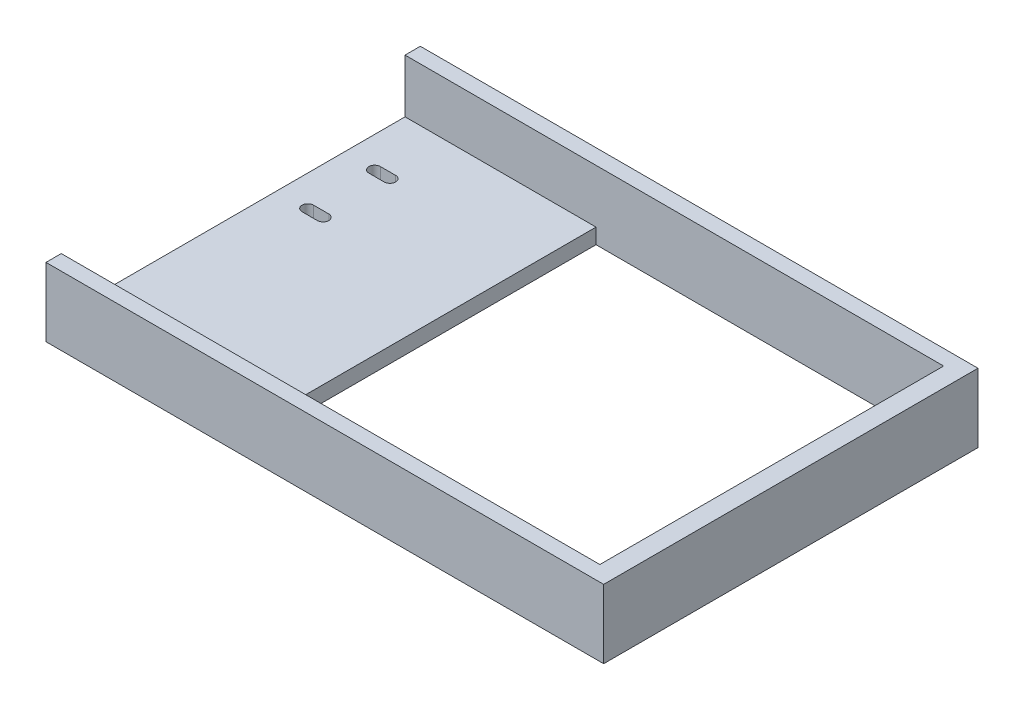
ISO-10303-21;
HEADER;
FILE_DESCRIPTION(('STEP AP214'),'2;1');
FILE_NAME('part.step','',(''),(''),'','','');
FILE_SCHEMA(('AUTOMOTIVE_DESIGN { 1 0 10303 214 1 1 1 1 }'));
ENDSEC;
DATA;
#1=APPLICATION_CONTEXT('core data for automotive mechanical design processes');
#2=APPLICATION_PROTOCOL_DEFINITION('international standard','automotive_design',2000,#1);
#3=PRODUCT_CONTEXT('',#1,'mechanical');
#4=PRODUCT('Part','Part','',(#3));
#5=PRODUCT_RELATED_PRODUCT_CATEGORY('part','',(#4));
#6=PRODUCT_DEFINITION_FORMATION('','',#4);
#7=PRODUCT_DEFINITION_CONTEXT('part definition',#1,'design');
#8=PRODUCT_DEFINITION('design','',#6,#7);
#9=PRODUCT_DEFINITION_SHAPE('','',#8);
#10=(LENGTH_UNIT() NAMED_UNIT(*) SI_UNIT(.MILLI.,.METRE.));
#11=(NAMED_UNIT(*) PLANE_ANGLE_UNIT() SI_UNIT($,.RADIAN.));
#12=(NAMED_UNIT(*) SI_UNIT($,.STERADIAN.) SOLID_ANGLE_UNIT());
#13=UNCERTAINTY_MEASURE_WITH_UNIT(LENGTH_MEASURE(1.E-05),#10,'distance_accuracy_value','');
#14=(GEOMETRIC_REPRESENTATION_CONTEXT(3) GLOBAL_UNCERTAINTY_ASSIGNED_CONTEXT((#13)) GLOBAL_UNIT_ASSIGNED_CONTEXT((#10,
#11,#12)) REPRESENTATION_CONTEXT('',''));
#15=CARTESIAN_POINT('',(0.,0.,0.));
#16=DIRECTION('',(0.,0.,1.));
#17=DIRECTION('',(1.,0.,0.));
#18=AXIS2_PLACEMENT_3D('',#15,#16,#17);
#19=CARTESIAN_POINT('',(-85.96875,18.,-46.375));
#20=DIRECTION('',(1.,0.,0.));
#21=DIRECTION('',(0.,0.,-1.));
#22=AXIS2_PLACEMENT_3D('',#19,#20,#21);
#23=PLANE('',#22);
#24=DIRECTION('',(0.,0.,1.));
#25=VECTOR('',#24,1.);
#26=CARTESIAN_POINT('',(-85.96875,4.,-42.375));
#27=LINE('',#26,#25);
#28=CARTESIAN_POINT('',(-85.96875,4.,-42.375));
#29=VERTEX_POINT('',#28);
#30=CARTESIAN_POINT('',(-85.96875,4.,47.625));
#31=VERTEX_POINT('',#30);
#32=EDGE_CURVE('E284',#29,#31,#27,.T.);
#33=ORIENTED_EDGE('',*,*,#32,.F.);
#34=DIRECTION('',(0.,1.,0.));
#35=VECTOR('',#34,1.);
#36=CARTESIAN_POINT('',(-85.96875,4.,-42.375));
#37=LINE('',#36,#35);
#38=CARTESIAN_POINT('',(-85.96875,18.,-42.375));
#39=VERTEX_POINT('',#38);
#40=EDGE_CURVE('E306',#29,#39,#37,.T.);
#41=ORIENTED_EDGE('',*,*,#40,.T.);
#42=DIRECTION('',(0.,0.,1.));
#43=VECTOR('',#42,1.);
#44=CARTESIAN_POINT('',(-85.96875,18.,-46.375));
#45=LINE('',#44,#43);
#46=CARTESIAN_POINT('',(-85.96875,18.,-46.375));
#47=VERTEX_POINT('',#46);
#48=EDGE_CURVE('E319',#47,#39,#45,.T.);
#49=ORIENTED_EDGE('',*,*,#48,.F.);
#50=DIRECTION('',(0.,-1.,0.));
#51=VECTOR('',#50,1.);
#52=CARTESIAN_POINT('',(-85.96875,18.,-46.375));
#53=LINE('',#52,#51);
#54=CARTESIAN_POINT('',(-85.96875,0.,-46.375));
#55=VERTEX_POINT('',#54);
#56=EDGE_CURVE('E333',#47,#55,#53,.T.);
#57=ORIENTED_EDGE('',*,*,#56,.T.);
#58=DIRECTION('',(0.,0.,1.));
#59=VECTOR('',#58,1.);
#60=CARTESIAN_POINT('',(-85.96875,0.,-46.375));
#61=LINE('',#60,#59);
#62=CARTESIAN_POINT('',(-85.96875,0.,51.625));
#63=VERTEX_POINT('',#62);
#64=EDGE_CURVE('E310',#55,#63,#61,.T.);
#65=ORIENTED_EDGE('',*,*,#64,.T.);
#66=DIRECTION('',(0.,-1.,0.));
#67=VECTOR('',#66,1.);
#68=CARTESIAN_POINT('',(-85.96875,18.,51.625));
#69=LINE('',#68,#67);
#70=CARTESIAN_POINT('',(-85.96875,18.,51.625));
#71=VERTEX_POINT('',#70);
#72=EDGE_CURVE('E11',#71,#63,#69,.T.);
#73=ORIENTED_EDGE('',*,*,#72,.F.);
#74=CARTESIAN_POINT('',(-85.96875,18.,47.625));
#75=VERTEX_POINT('',#74);
#76=EDGE_CURVE('E324',#75,#71,#45,.T.);
#77=ORIENTED_EDGE('',*,*,#76,.F.);
#78=DIRECTION('',(0.,1.,0.));
#79=VECTOR('',#78,1.);
#80=CARTESIAN_POINT('',(-85.96875,4.,47.625));
#81=LINE('',#80,#79);
#82=EDGE_CURVE('E296',#31,#75,#81,.T.);
#83=ORIENTED_EDGE('',*,*,#82,.F.);
#84=EDGE_LOOP('',(#33,#41,#49,#57,#65,#73,#77,#83));
#85=FACE_BOUND('',#84,.T.);
#86=ADVANCED_FACE('F39',(#85),#23,.F.);
#87=CARTESIAN_POINT('',(-85.96875,18.,51.625));
#88=DIRECTION('',(0.,0.,-1.));
#89=DIRECTION('',(-1.,0.,0.));
#90=AXIS2_PLACEMENT_3D('',#87,#88,#89);
#91=PLANE('',#90);
#92=DIRECTION('',(1.,0.,0.));
#93=VECTOR('',#92,1.);
#94=CARTESIAN_POINT('',(-85.96875,0.,51.625));
#95=LINE('',#94,#93);
#96=CARTESIAN_POINT('',(60.03125,0.,51.625));
#97=VERTEX_POINT('',#96);
#98=EDGE_CURVE('E337',#63,#97,#95,.T.);
#99=ORIENTED_EDGE('',*,*,#98,.T.);
#100=DIRECTION('',(0.,-1.,0.));
#101=VECTOR('',#100,1.);
#102=CARTESIAN_POINT('',(60.03125,18.,51.625));
#103=LINE('',#102,#101);
#104=CARTESIAN_POINT('',(60.03125,18.,51.625));
#105=VERTEX_POINT('',#104);
#106=EDGE_CURVE('E47',#105,#97,#103,.T.);
#107=ORIENTED_EDGE('',*,*,#106,.F.);
#108=DIRECTION('',(1.,0.,0.));
#109=VECTOR('',#108,1.);
#110=CARTESIAN_POINT('',(-85.96875,18.,51.625));
#111=LINE('',#110,#109);
#112=EDGE_CURVE('E323',#71,#105,#111,.T.);
#113=ORIENTED_EDGE('',*,*,#112,.F.);
#114=ORIENTED_EDGE('',*,*,#72,.T.);
#115=EDGE_LOOP('',(#99,#107,#113,#114));
#116=FACE_BOUND('',#115,.T.);
#117=ADVANCED_FACE('F381',(#116),#91,.F.);
#118=CARTESIAN_POINT('',(60.03125,18.,-46.375));
#119=DIRECTION('',(-1.,0.,0.));
#120=DIRECTION('',(0.,0.,1.));
#121=AXIS2_PLACEMENT_3D('',#118,#119,#120);
#122=PLANE('',#121);
#123=DIRECTION('',(0.,0.,-1.));
#124=VECTOR('',#123,1.);
#125=CARTESIAN_POINT('',(60.03125,0.,-46.375));
#126=LINE('',#125,#124);
#127=CARTESIAN_POINT('',(60.03125,0.,-46.375));
#128=VERTEX_POINT('',#127);
#129=EDGE_CURVE('E340',#97,#128,#126,.T.);
#130=ORIENTED_EDGE('',*,*,#129,.T.);
#131=DIRECTION('',(0.,-1.,0.));
#132=VECTOR('',#131,1.);
#133=CARTESIAN_POINT('',(60.03125,18.,-46.375));
#134=LINE('',#133,#132);
#135=CARTESIAN_POINT('',(60.03125,18.,-46.375));
#136=VERTEX_POINT('',#135);
#137=EDGE_CURVE('E349',#136,#128,#134,.T.);
#138=ORIENTED_EDGE('',*,*,#137,.F.);
#139=DIRECTION('',(0.,0.,-1.));
#140=VECTOR('',#139,1.);
#141=CARTESIAN_POINT('',(60.03125,18.,-46.375));
#142=LINE('',#141,#140);
#143=EDGE_CURVE('E327',#105,#136,#142,.T.);
#144=ORIENTED_EDGE('',*,*,#143,.F.);
#145=ORIENTED_EDGE('',*,*,#106,.T.);
#146=EDGE_LOOP('',(#130,#138,#144,#145));
#147=FACE_BOUND('',#146,.T.);
#148=ADVANCED_FACE('F358',(#147),#122,.F.);
#149=CARTESIAN_POINT('',(-85.96875,18.,-46.375));
#150=DIRECTION('',(0.,0.,1.));
#151=DIRECTION('',(1.,0.,0.));
#152=AXIS2_PLACEMENT_3D('',#149,#150,#151);
#153=PLANE('',#152);
#154=DIRECTION('',(-1.,0.,0.));
#155=VECTOR('',#154,1.);
#156=CARTESIAN_POINT('',(-85.96875,0.,-46.375));
#157=LINE('',#156,#155);
#158=EDGE_CURVE('E343',#128,#55,#157,.T.);
#159=ORIENTED_EDGE('',*,*,#158,.T.);
#160=ORIENTED_EDGE('',*,*,#56,.F.);
#161=DIRECTION('',(-1.,0.,0.));
#162=VECTOR('',#161,1.);
#163=CARTESIAN_POINT('',(-85.96875,18.,-46.375));
#164=LINE('',#163,#162);
#165=EDGE_CURVE('E330',#136,#47,#164,.T.);
#166=ORIENTED_EDGE('',*,*,#165,.F.);
#167=ORIENTED_EDGE('',*,*,#137,.T.);
#168=EDGE_LOOP('',(#159,#160,#166,#167));
#169=FACE_BOUND('',#168,.T.);
#170=ADVANCED_FACE('F368',(#169),#153,.F.);
#171=CARTESIAN_POINT('',(0.,18.,0.));
#172=DIRECTION('',(0.,1.,0.));
#173=DIRECTION('',(0.,0.,1.));
#174=AXIS2_PLACEMENT_3D('',#171,#172,#173);
#175=PLANE('',#174);
#176=DIRECTION('',(-1.,0.,0.));
#177=VECTOR('',#176,1.);
#178=CARTESIAN_POINT('',(-85.96875,18.,-42.375));
#179=LINE('',#178,#177);
#180=CARTESIAN_POINT('',(55.03125,18.,-42.375));
#181=VERTEX_POINT('',#180);
#182=EDGE_CURVE('E289',#181,#39,#179,.T.);
#183=ORIENTED_EDGE('',*,*,#182,.F.);
#184=DIRECTION('',(0.,0.,-1.));
#185=VECTOR('',#184,1.);
#186=CARTESIAN_POINT('',(55.03125,18.,-42.375));
#187=LINE('',#186,#185);
#188=CARTESIAN_POINT('',(55.03125,18.,47.625));
#189=VERTEX_POINT('',#188);
#190=EDGE_CURVE('E300',#189,#181,#187,.T.);
#191=ORIENTED_EDGE('',*,*,#190,.F.);
#192=DIRECTION('',(1.,0.,0.));
#193=VECTOR('',#192,1.);
#194=CARTESIAN_POINT('',(-85.96875,18.,47.625));
#195=LINE('',#194,#193);
#196=EDGE_CURVE('E283',#75,#189,#195,.T.);
#197=ORIENTED_EDGE('',*,*,#196,.F.);
#198=ORIENTED_EDGE('',*,*,#76,.T.);
#199=ORIENTED_EDGE('',*,*,#112,.T.);
#200=ORIENTED_EDGE('',*,*,#143,.T.);
#201=ORIENTED_EDGE('',*,*,#165,.T.);
#202=ORIENTED_EDGE('',*,*,#48,.T.);
#203=EDGE_LOOP('',(#183,#191,#197,#198,#199,#200,#201,#202));
#204=FACE_BOUND('',#203,.T.);
#205=ADVANCED_FACE('F377',(#204),#175,.T.);
#206=CARTESIAN_POINT('',(0.,0.,0.));
#207=DIRECTION('',(0.,1.,0.));
#208=DIRECTION('',(0.,0.,1.));
#209=AXIS2_PLACEMENT_3D('',#206,#207,#208);
#210=PLANE('',#209);
#211=DIRECTION('',(1.,0.,0.));
#212=VECTOR('',#211,1.);
#213=CARTESIAN_POINT('',(0.,0.,-24.875));
#214=LINE('',#213,#212);
#215=CARTESIAN_POINT('',(-77.9313889888194,0.,-24.875));
#216=VERTEX_POINT('',#215);
#217=CARTESIAN_POINT('',(-73.9313889888194,0.,-24.875));
#218=VERTEX_POINT('',#217);
#219=EDGE_CURVE('E249',#216,#218,#214,.T.);
#220=ORIENTED_EDGE('',*,*,#219,.T.);
#221=CARTESIAN_POINT('',(-73.9313889888194,0.,-26.375));
#222=DIRECTION('',(0.,1.,0.));
#223=DIRECTION('',(0.,0.,1.));
#224=AXIS2_PLACEMENT_3D('',#221,#222,#223);
#225=CIRCLE('',#224,1.49999999999999);
#226=CARTESIAN_POINT('',(-73.9313889888194,0.,-27.875));
#227=VERTEX_POINT('',#226);
#228=EDGE_CURVE('E253',#218,#227,#225,.T.);
#229=ORIENTED_EDGE('',*,*,#228,.T.);
#230=DIRECTION('',(-1.,0.,0.));
#231=VECTOR('',#230,1.);
#232=CARTESIAN_POINT('',(0.,0.,-27.875));
#233=LINE('',#232,#231);
#234=CARTESIAN_POINT('',(-77.9313889888194,0.,-27.875));
#235=VERTEX_POINT('',#234);
#236=EDGE_CURVE('E244',#227,#235,#233,.T.);
#237=ORIENTED_EDGE('',*,*,#236,.T.);
#238=CARTESIAN_POINT('',(-77.9313889888194,0.,-26.375));
#239=DIRECTION('',(0.,1.,0.));
#240=DIRECTION('',(0.,0.,1.));
#241=AXIS2_PLACEMENT_3D('',#238,#239,#240);
#242=CIRCLE('',#241,1.49999999999999);
#243=EDGE_CURVE('E169',#235,#216,#242,.T.);
#244=ORIENTED_EDGE('',*,*,#243,.T.);
#245=EDGE_LOOP('',(#220,#229,#237,#244));
#246=FACE_BOUND('',#245,.T.);
#247=DIRECTION('',(1.,0.,0.));
#248=VECTOR('',#247,1.);
#249=CARTESIAN_POINT('',(0.,0.,-7.37500000000001));
#250=LINE('',#249,#248);
#251=CARTESIAN_POINT('',(-77.9313889888193,0.,-7.37499999999999));
#252=VERTEX_POINT('',#251);
#253=CARTESIAN_POINT('',(-73.9313889888192,0.,-7.375));
#254=VERTEX_POINT('',#253);
#255=EDGE_CURVE('E236',#252,#254,#250,.T.);
#256=ORIENTED_EDGE('',*,*,#255,.T.);
#257=CARTESIAN_POINT('',(-73.9313889888192,0.,-8.875));
#258=DIRECTION('',(0.,1.,0.));
#259=DIRECTION('',(0.,0.,1.));
#260=AXIS2_PLACEMENT_3D('',#257,#258,#259);
#261=CIRCLE('',#260,1.5);
#262=CARTESIAN_POINT('',(-73.9313889888192,0.,-10.375));
#263=VERTEX_POINT('',#262);
#264=EDGE_CURVE('E240',#254,#263,#261,.T.);
#265=ORIENTED_EDGE('',*,*,#264,.T.);
#266=DIRECTION('',(-1.,0.,0.));
#267=VECTOR('',#266,1.);
#268=CARTESIAN_POINT('',(0.,0.,-10.375));
#269=LINE('',#268,#267);
#270=CARTESIAN_POINT('',(-77.9313889888193,0.,-10.375));
#271=VERTEX_POINT('',#270);
#272=EDGE_CURVE('E198',#263,#271,#269,.T.);
#273=ORIENTED_EDGE('',*,*,#272,.T.);
#274=CARTESIAN_POINT('',(-77.9313889888193,0.,-8.87499999999999));
#275=DIRECTION('',(0.,1.,0.));
#276=DIRECTION('',(0.,0.,1.));
#277=AXIS2_PLACEMENT_3D('',#274,#275,#276);
#278=CIRCLE('',#277,1.5);
#279=EDGE_CURVE('E232',#271,#252,#278,.T.);
#280=ORIENTED_EDGE('',*,*,#279,.T.);
#281=EDGE_LOOP('',(#256,#265,#273,#280));
#282=FACE_BOUND('',#281,.T.);
#283=DIRECTION('',(-1.,0.,0.));
#284=VECTOR('',#283,1.);
#285=CARTESIAN_POINT('',(0.,0.,-42.375));
#286=LINE('',#285,#284);
#287=CARTESIAN_POINT('',(55.03125,0.,-42.375));
#288=VERTEX_POINT('',#287);
#289=CARTESIAN_POINT('',(-35.96875,0.,-42.375));
#290=VERTEX_POINT('',#289);
#291=EDGE_CURVE('E275',#288,#290,#286,.T.);
#292=ORIENTED_EDGE('',*,*,#291,.T.);
#293=DIRECTION('',(0.,0.,1.));
#294=VECTOR('',#293,1.);
#295=CARTESIAN_POINT('',(-35.96875,0.,0.));
#296=LINE('',#295,#294);
#297=CARTESIAN_POINT('',(-35.96875,0.,47.625));
#298=VERTEX_POINT('',#297);
#299=EDGE_CURVE('E279',#290,#298,#296,.T.);
#300=ORIENTED_EDGE('',*,*,#299,.T.);
#301=DIRECTION('',(1.,0.,0.));
#302=VECTOR('',#301,1.);
#303=CARTESIAN_POINT('',(0.,0.,47.625));
#304=LINE('',#303,#302);
#305=CARTESIAN_POINT('',(55.03125,0.,47.625));
#306=VERTEX_POINT('',#305);
#307=EDGE_CURVE('E264',#298,#306,#304,.T.);
#308=ORIENTED_EDGE('',*,*,#307,.T.);
#309=DIRECTION('',(0.,0.,-1.));
#310=VECTOR('',#309,1.);
#311=CARTESIAN_POINT('',(55.03125,0.,0.));
#312=LINE('',#311,#310);
#313=EDGE_CURVE('E271',#306,#288,#312,.T.);
#314=ORIENTED_EDGE('',*,*,#313,.T.);
#315=EDGE_LOOP('',(#292,#300,#308,#314));
#316=FACE_BOUND('',#315,.T.);
#317=ORIENTED_EDGE('',*,*,#64,.F.);
#318=ORIENTED_EDGE('',*,*,#158,.F.);
#319=ORIENTED_EDGE('',*,*,#129,.F.);
#320=ORIENTED_EDGE('',*,*,#98,.F.);
#321=EDGE_LOOP('',(#317,#318,#319,#320));
#322=FACE_BOUND('',#321,.T.);
#323=ADVANCED_FACE('F365',(#246,#282,#316,#322),#210,.F.);
#324=CARTESIAN_POINT('',(-85.96875,4.,-42.375));
#325=DIRECTION('',(0.,0.,-1.));
#326=DIRECTION('',(-1.,0.,0.));
#327=AXIS2_PLACEMENT_3D('',#324,#325,#326);
#328=PLANE('',#327);
#329=ORIENTED_EDGE('',*,*,#182,.T.);
#330=ORIENTED_EDGE('',*,*,#40,.F.);
#331=DIRECTION('',(-1.,0.,0.));
#332=VECTOR('',#331,1.);
#333=CARTESIAN_POINT('',(-85.96875,4.,-42.375));
#334=LINE('',#333,#332);
#335=CARTESIAN_POINT('',(-35.96875,4.,-42.375));
#336=VERTEX_POINT('',#335);
#337=EDGE_CURVE('E293',#336,#29,#334,.T.);
#338=ORIENTED_EDGE('',*,*,#337,.F.);
#339=DIRECTION('',(0.,1.,0.));
#340=VECTOR('',#339,1.);
#341=CARTESIAN_POINT('',(-35.96875,-13.,-42.375));
#342=LINE('',#341,#340);
#343=EDGE_CURVE('E261',#290,#336,#342,.T.);
#344=ORIENTED_EDGE('',*,*,#343,.F.);
#345=ORIENTED_EDGE('',*,*,#291,.F.);
#346=DIRECTION('',(0.,1.,0.));
#347=VECTOR('',#346,1.);
#348=CARTESIAN_POINT('',(55.03125,4.,-42.375));
#349=LINE('',#348,#347);
#350=EDGE_CURVE('E311',#288,#181,#349,.T.);
#351=ORIENTED_EDGE('',*,*,#350,.T.);
#352=EDGE_LOOP('',(#329,#330,#338,#344,#345,#351));
#353=FACE_BOUND('',#352,.T.);
#354=ADVANCED_FACE('F397',(#353),#328,.F.);
#355=CARTESIAN_POINT('',(55.03125,4.,-42.375));
#356=DIRECTION('',(1.,0.,0.));
#357=DIRECTION('',(0.,0.,-1.));
#358=AXIS2_PLACEMENT_3D('',#355,#356,#357);
#359=PLANE('',#358);
#360=ORIENTED_EDGE('',*,*,#190,.T.);
#361=ORIENTED_EDGE('',*,*,#350,.F.);
#362=ORIENTED_EDGE('',*,*,#313,.F.);
#363=DIRECTION('',(0.,1.,0.));
#364=VECTOR('',#363,1.);
#365=CARTESIAN_POINT('',(55.03125,4.,47.625));
#366=LINE('',#365,#364);
#367=EDGE_CURVE('E314',#306,#189,#366,.T.);
#368=ORIENTED_EDGE('',*,*,#367,.T.);
#369=EDGE_LOOP('',(#360,#361,#362,#368));
#370=FACE_BOUND('',#369,.T.);
#371=ADVANCED_FACE('F387',(#370),#359,.F.);
#372=CARTESIAN_POINT('',(-85.96875,4.,47.625));
#373=DIRECTION('',(0.,0.,1.));
#374=DIRECTION('',(1.,0.,0.));
#375=AXIS2_PLACEMENT_3D('',#372,#373,#374);
#376=PLANE('',#375);
#377=ORIENTED_EDGE('',*,*,#196,.T.);
#378=ORIENTED_EDGE('',*,*,#367,.F.);
#379=ORIENTED_EDGE('',*,*,#307,.F.);
#380=DIRECTION('',(0.,1.,0.));
#381=VECTOR('',#380,1.);
#382=CARTESIAN_POINT('',(-35.96875,-13.,47.625));
#383=LINE('',#382,#381);
#384=CARTESIAN_POINT('',(-35.96875,4.,47.625));
#385=VERTEX_POINT('',#384);
#386=EDGE_CURVE('E260',#298,#385,#383,.T.);
#387=ORIENTED_EDGE('',*,*,#386,.T.);
#388=DIRECTION('',(1.,0.,0.));
#389=VECTOR('',#388,1.);
#390=CARTESIAN_POINT('',(-85.96875,4.,47.625));
#391=LINE('',#390,#389);
#392=EDGE_CURVE('E288',#31,#385,#391,.T.);
#393=ORIENTED_EDGE('',*,*,#392,.F.);
#394=ORIENTED_EDGE('',*,*,#82,.T.);
#395=EDGE_LOOP('',(#377,#378,#379,#387,#393,#394));
#396=FACE_BOUND('',#395,.T.);
#397=ADVANCED_FACE('F385',(#396),#376,.F.);
#398=CARTESIAN_POINT('',(0.,4.,0.));
#399=DIRECTION('',(0.,1.,0.));
#400=DIRECTION('',(0.,0.,1.));
#401=AXIS2_PLACEMENT_3D('',#398,#399,#400);
#402=PLANE('',#401);
#403=CARTESIAN_POINT('',(-73.9313889888194,4.,-26.375));
#404=DIRECTION('',(0.,1.,0.));
#405=DIRECTION('',(0.,0.,1.));
#406=AXIS2_PLACEMENT_3D('',#403,#404,#405);
#407=CIRCLE('',#406,1.49999999999999);
#408=CARTESIAN_POINT('',(-73.9313889888194,4.,-24.875));
#409=VERTEX_POINT('',#408);
#410=CARTESIAN_POINT('',(-73.9313889888194,4.,-27.875));
#411=VERTEX_POINT('',#410);
#412=EDGE_CURVE('E183',#409,#411,#407,.T.);
#413=ORIENTED_EDGE('',*,*,#412,.F.);
#414=DIRECTION('',(1.,0.,0.));
#415=VECTOR('',#414,1.);
#416=CARTESIAN_POINT('',(-73.9313889888194,4.,-24.875));
#417=LINE('',#416,#415);
#418=CARTESIAN_POINT('',(-77.9313889888194,4.,-24.875));
#419=VERTEX_POINT('',#418);
#420=EDGE_CURVE('E188',#419,#409,#417,.T.);
#421=ORIENTED_EDGE('',*,*,#420,.F.);
#422=CARTESIAN_POINT('',(-77.9313889888194,4.,-26.375));
#423=DIRECTION('',(0.,1.,0.));
#424=DIRECTION('',(0.,0.,1.));
#425=AXIS2_PLACEMENT_3D('',#422,#423,#424);
#426=CIRCLE('',#425,1.49999999999999);
#427=CARTESIAN_POINT('',(-77.9313889888194,4.,-27.875));
#428=VERTEX_POINT('',#427);
#429=EDGE_CURVE('E166',#428,#419,#426,.T.);
#430=ORIENTED_EDGE('',*,*,#429,.F.);
#431=DIRECTION('',(-1.,0.,0.));
#432=VECTOR('',#431,1.);
#433=CARTESIAN_POINT('',(-73.9313889888194,4.,-27.875));
#434=LINE('',#433,#432);
#435=EDGE_CURVE('E177',#411,#428,#434,.T.);
#436=ORIENTED_EDGE('',*,*,#435,.F.);
#437=EDGE_LOOP('',(#413,#421,#430,#436));
#438=FACE_BOUND('',#437,.T.);
#439=CARTESIAN_POINT('',(-73.9313889888192,4.,-8.875));
#440=DIRECTION('',(0.,1.,0.));
#441=DIRECTION('',(0.,0.,1.));
#442=AXIS2_PLACEMENT_3D('',#439,#440,#441);
#443=CIRCLE('',#442,1.5);
#444=CARTESIAN_POINT('',(-73.9313889888192,4.,-7.375));
#445=VERTEX_POINT('',#444);
#446=CARTESIAN_POINT('',(-73.9313889888192,4.,-10.375));
#447=VERTEX_POINT('',#446);
#448=EDGE_CURVE('E203',#445,#447,#443,.T.);
#449=ORIENTED_EDGE('',*,*,#448,.F.);
#450=DIRECTION('',(1.,0.,0.));
#451=VECTOR('',#450,1.);
#452=CARTESIAN_POINT('',(-73.9313889888192,4.,-7.375));
#453=LINE('',#452,#451);
#454=CARTESIAN_POINT('',(-77.9313889888193,4.,-7.37499999999999));
#455=VERTEX_POINT('',#454);
#456=EDGE_CURVE('E213',#455,#445,#453,.T.);
#457=ORIENTED_EDGE('',*,*,#456,.F.);
#458=CARTESIAN_POINT('',(-77.9313889888193,4.,-8.87499999999999));
#459=DIRECTION('',(0.,1.,0.));
#460=DIRECTION('',(0.,0.,1.));
#461=AXIS2_PLACEMENT_3D('',#458,#459,#460);
#462=CIRCLE('',#461,1.5);
#463=CARTESIAN_POINT('',(-77.9313889888193,4.,-10.375));
#464=VERTEX_POINT('',#463);
#465=EDGE_CURVE('E209',#464,#455,#462,.T.);
#466=ORIENTED_EDGE('',*,*,#465,.F.);
#467=DIRECTION('',(-1.,0.,0.));
#468=VECTOR('',#467,1.);
#469=CARTESIAN_POINT('',(-73.9313889888192,4.,-10.375));
#470=LINE('',#469,#468);
#471=EDGE_CURVE('E206',#447,#464,#470,.T.);
#472=ORIENTED_EDGE('',*,*,#471,.F.);
#473=EDGE_LOOP('',(#449,#457,#466,#472));
#474=FACE_BOUND('',#473,.T.);
#475=DIRECTION('',(0.,0.,1.));
#476=VECTOR('',#475,1.);
#477=CARTESIAN_POINT('',(-35.96875,4.,-42.375));
#478=LINE('',#477,#476);
#479=EDGE_CURVE('E257',#336,#385,#478,.T.);
#480=ORIENTED_EDGE('',*,*,#479,.F.);
#481=ORIENTED_EDGE('',*,*,#337,.T.);
#482=ORIENTED_EDGE('',*,*,#32,.T.);
#483=ORIENTED_EDGE('',*,*,#392,.T.);
#484=EDGE_LOOP('',(#480,#481,#482,#483));
#485=FACE_BOUND('',#484,.T.);
#486=ADVANCED_FACE('F185',(#438,#474,#485),#402,.T.);
#487=CARTESIAN_POINT('',(-35.96875,-13.,-42.375));
#488=DIRECTION('',(-1.,0.,0.));
#489=DIRECTION('',(0.,0.,1.));
#490=AXIS2_PLACEMENT_3D('',#487,#488,#489);
#491=PLANE('',#490);
#492=ORIENTED_EDGE('',*,*,#343,.T.);
#493=ORIENTED_EDGE('',*,*,#479,.T.);
#494=ORIENTED_EDGE('',*,*,#386,.F.);
#495=ORIENTED_EDGE('',*,*,#299,.F.);
#496=EDGE_LOOP('',(#492,#493,#494,#495));
#497=FACE_BOUND('',#496,.T.);
#498=ADVANCED_FACE('F393',(#497),#491,.F.);
#499=CARTESIAN_POINT('',(-73.9313889888192,-13.,-8.875));
#500=DIRECTION('',(0.,1.,0.));
#501=DIRECTION('',(0.,0.,1.));
#502=AXIS2_PLACEMENT_3D('',#499,#500,#501);
#503=CYLINDRICAL_SURFACE('',#502,1.5);
#504=DIRECTION('',(0.,1.,0.));
#505=VECTOR('',#504,1.);
#506=CARTESIAN_POINT('',(-73.9313889888192,-13.,-7.375));
#507=LINE('',#506,#505);
#508=EDGE_CURVE('E218',#254,#445,#507,.T.);
#509=ORIENTED_EDGE('',*,*,#508,.T.);
#510=ORIENTED_EDGE('',*,*,#448,.T.);
#511=DIRECTION('',(0.,1.,0.));
#512=VECTOR('',#511,1.);
#513=CARTESIAN_POINT('',(-73.9313889888192,-13.,-10.375));
#514=LINE('',#513,#512);
#515=EDGE_CURVE('E217',#263,#447,#514,.T.);
#516=ORIENTED_EDGE('',*,*,#515,.F.);
#517=ORIENTED_EDGE('',*,*,#264,.F.);
#518=EDGE_LOOP('',(#509,#510,#516,#517));
#519=FACE_BOUND('',#518,.T.);
#520=ADVANCED_FACE('F406',(#519),#503,.F.);
#521=CARTESIAN_POINT('',(-73.9313889888192,-13.,-7.375));
#522=DIRECTION('',(0.,0.,1.));
#523=DIRECTION('',(1.,0.,0.));
#524=AXIS2_PLACEMENT_3D('',#521,#522,#523);
#525=PLANE('',#524);
#526=DIRECTION('',(0.,1.,0.));
#527=VECTOR('',#526,1.);
#528=CARTESIAN_POINT('',(-77.9313889888193,-13.,-7.37499999999999));
#529=LINE('',#528,#527);
#530=EDGE_CURVE('E221',#252,#455,#529,.T.);
#531=ORIENTED_EDGE('',*,*,#530,.T.);
#532=ORIENTED_EDGE('',*,*,#456,.T.);
#533=ORIENTED_EDGE('',*,*,#508,.F.);
#534=ORIENTED_EDGE('',*,*,#255,.F.);
#535=EDGE_LOOP('',(#531,#532,#533,#534));
#536=FACE_BOUND('',#535,.T.);
#537=ADVANCED_FACE('F467',(#536),#525,.F.);
#538=CARTESIAN_POINT('',(-77.9313889888193,-13.,-8.87499999999999));
#539=DIRECTION('',(0.,1.,0.));
#540=DIRECTION('',(0.,0.,1.));
#541=AXIS2_PLACEMENT_3D('',#538,#539,#540);
#542=CYLINDRICAL_SURFACE('',#541,1.5);
#543=DIRECTION('',(0.,1.,0.));
#544=VECTOR('',#543,1.);
#545=CARTESIAN_POINT('',(-77.9313889888193,-13.,-10.375));
#546=LINE('',#545,#544);
#547=EDGE_CURVE('E62',#271,#464,#546,.T.);
#548=ORIENTED_EDGE('',*,*,#547,.T.);
#549=ORIENTED_EDGE('',*,*,#465,.T.);
#550=ORIENTED_EDGE('',*,*,#530,.F.);
#551=ORIENTED_EDGE('',*,*,#279,.F.);
#552=EDGE_LOOP('',(#548,#549,#550,#551));
#553=FACE_BOUND('',#552,.T.);
#554=ADVANCED_FACE('F477',(#553),#542,.F.);
#555=CARTESIAN_POINT('',(-73.9313889888192,-13.,-10.375));
#556=DIRECTION('',(0.,0.,-1.));
#557=DIRECTION('',(-1.,0.,0.));
#558=AXIS2_PLACEMENT_3D('',#555,#556,#557);
#559=PLANE('',#558);
#560=ORIENTED_EDGE('',*,*,#515,.T.);
#561=ORIENTED_EDGE('',*,*,#471,.T.);
#562=ORIENTED_EDGE('',*,*,#547,.F.);
#563=ORIENTED_EDGE('',*,*,#272,.F.);
#564=EDGE_LOOP('',(#560,#561,#562,#563));
#565=FACE_BOUND('',#564,.T.);
#566=ADVANCED_FACE('F487',(#565),#559,.F.);
#567=CARTESIAN_POINT('',(-73.9313889888194,-13.,-26.375));
#568=DIRECTION('',(0.,1.,0.));
#569=DIRECTION('',(0.,0.,1.));
#570=AXIS2_PLACEMENT_3D('',#567,#568,#569);
#571=CYLINDRICAL_SURFACE('',#570,1.49999999999999);
#572=DIRECTION('',(0.,1.,0.));
#573=VECTOR('',#572,1.);
#574=CARTESIAN_POINT('',(-73.9313889888194,-13.,-24.875));
#575=LINE('',#574,#573);
#576=EDGE_CURVE('E195',#218,#409,#575,.T.);
#577=ORIENTED_EDGE('',*,*,#576,.T.);
#578=ORIENTED_EDGE('',*,*,#412,.T.);
#579=DIRECTION('',(0.,1.,0.));
#580=VECTOR('',#579,1.);
#581=CARTESIAN_POINT('',(-73.9313889888194,-13.,-27.875));
#582=LINE('',#581,#580);
#583=EDGE_CURVE('E173',#227,#411,#582,.T.);
#584=ORIENTED_EDGE('',*,*,#583,.F.);
#585=ORIENTED_EDGE('',*,*,#228,.F.);
#586=EDGE_LOOP('',(#577,#578,#584,#585));
#587=FACE_BOUND('',#586,.T.);
#588=ADVANCED_FACE('F497',(#587),#571,.F.);
#589=CARTESIAN_POINT('',(-73.9313889888194,-13.,-24.875));
#590=DIRECTION('',(0.,0.,1.));
#591=DIRECTION('',(1.,0.,0.));
#592=AXIS2_PLACEMENT_3D('',#589,#590,#591);
#593=PLANE('',#592);
#594=DIRECTION('',(0.,1.,0.));
#595=VECTOR('',#594,1.);
#596=CARTESIAN_POINT('',(-77.9313889888194,-13.,-24.875));
#597=LINE('',#596,#595);
#598=EDGE_CURVE('E172',#216,#419,#597,.T.);
#599=ORIENTED_EDGE('',*,*,#598,.T.);
#600=ORIENTED_EDGE('',*,*,#420,.T.);
#601=ORIENTED_EDGE('',*,*,#576,.F.);
#602=ORIENTED_EDGE('',*,*,#219,.F.);
#603=EDGE_LOOP('',(#599,#600,#601,#602));
#604=FACE_BOUND('',#603,.T.);
#605=ADVANCED_FACE('F506',(#604),#593,.F.);
#606=CARTESIAN_POINT('',(-77.9313889888194,-13.,-26.375));
#607=DIRECTION('',(0.,1.,0.));
#608=DIRECTION('',(0.,0.,1.));
#609=AXIS2_PLACEMENT_3D('',#606,#607,#608);
#610=CYLINDRICAL_SURFACE('',#609,1.49999999999999);
#611=DIRECTION('',(0.,1.,0.));
#612=VECTOR('',#611,1.);
#613=CARTESIAN_POINT('',(-77.9313889888194,-13.,-27.875));
#614=LINE('',#613,#612);
#615=EDGE_CURVE('E54',#235,#428,#614,.T.);
#616=ORIENTED_EDGE('',*,*,#615,.T.);
#617=ORIENTED_EDGE('',*,*,#429,.T.);
#618=ORIENTED_EDGE('',*,*,#598,.F.);
#619=ORIENTED_EDGE('',*,*,#243,.F.);
#620=EDGE_LOOP('',(#616,#617,#618,#619));
#621=FACE_BOUND('',#620,.T.);
#622=ADVANCED_FACE('F163',(#621),#610,.F.);
#623=CARTESIAN_POINT('',(-73.9313889888194,-13.,-27.875));
#624=DIRECTION('',(0.,0.,-1.));
#625=DIRECTION('',(-1.,0.,0.));
#626=AXIS2_PLACEMENT_3D('',#623,#624,#625);
#627=PLANE('',#626);
#628=ORIENTED_EDGE('',*,*,#583,.T.);
#629=ORIENTED_EDGE('',*,*,#435,.T.);
#630=ORIENTED_EDGE('',*,*,#615,.F.);
#631=ORIENTED_EDGE('',*,*,#236,.F.);
#632=EDGE_LOOP('',(#628,#629,#630,#631));
#633=FACE_BOUND('',#632,.T.);
#634=ADVANCED_FACE('F178',(#633),#627,.F.);
#635=CLOSED_SHELL('',(#86,#117,#148,#170,#205,#323,#354,#371,#397,#486,#498,#520,#537,#554,#566,
#588,#605,#622,#634));
#636=MANIFOLD_SOLID_BREP('B2',#635);
#637=ADVANCED_BREP_SHAPE_REPRESENTATION('',(#18,#636),#14);
#638=SHAPE_DEFINITION_REPRESENTATION(#9,#637);
ENDSEC;
END-ISO-10303-21;
